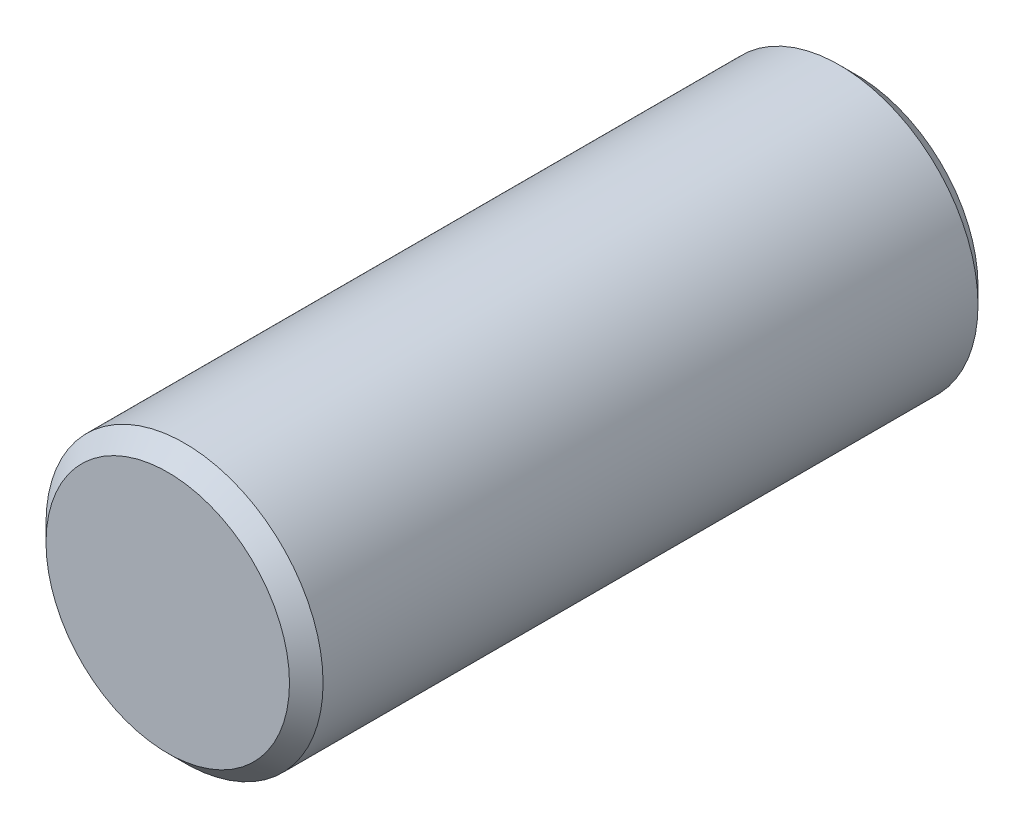
ISO-10303-21;
HEADER;
FILE_DESCRIPTION(('STEP AP214'),'2;1');
FILE_NAME('part.step','',(''),(''),'','','');
FILE_SCHEMA(('AUTOMOTIVE_DESIGN { 1 0 10303 214 1 1 1 1 }'));
ENDSEC;
DATA;
#1=APPLICATION_CONTEXT('core data for automotive mechanical design processes');
#2=APPLICATION_PROTOCOL_DEFINITION('international standard','automotive_design',2000,#1);
#3=PRODUCT_CONTEXT('',#1,'mechanical');
#4=PRODUCT('Part','Part','',(#3));
#5=PRODUCT_RELATED_PRODUCT_CATEGORY('part','',(#4));
#6=PRODUCT_DEFINITION_FORMATION('','',#4);
#7=PRODUCT_DEFINITION_CONTEXT('part definition',#1,'design');
#8=PRODUCT_DEFINITION('design','',#6,#7);
#9=PRODUCT_DEFINITION_SHAPE('','',#8);
#10=(LENGTH_UNIT() NAMED_UNIT(*) SI_UNIT(.MILLI.,.METRE.));
#11=(NAMED_UNIT(*) PLANE_ANGLE_UNIT() SI_UNIT($,.RADIAN.));
#12=(NAMED_UNIT(*) SI_UNIT($,.STERADIAN.) SOLID_ANGLE_UNIT());
#13=UNCERTAINTY_MEASURE_WITH_UNIT(LENGTH_MEASURE(1.E-05),#10,'distance_accuracy_value','');
#14=(GEOMETRIC_REPRESENTATION_CONTEXT(3) GLOBAL_UNCERTAINTY_ASSIGNED_CONTEXT((#13)) GLOBAL_UNIT_ASSIGNED_CONTEXT((#10,
#11,#12)) REPRESENTATION_CONTEXT('',''));
#15=CARTESIAN_POINT('',(0.,0.,0.));
#16=DIRECTION('',(0.,0.,1.));
#17=DIRECTION('',(1.,0.,0.));
#18=AXIS2_PLACEMENT_3D('',#15,#16,#17);
#19=CARTESIAN_POINT('',(0.,0.,41.));
#20=DIRECTION('',(0.,0.,-1.));
#21=DIRECTION('',(-1.,0.,0.));
#22=AXIS2_PLACEMENT_3D('',#19,#20,#21);
#23=CYLINDRICAL_SURFACE('',#22,16.5);
#24=CARTESIAN_POINT('',(0.,0.,-39.));
#25=DIRECTION('',(0.,0.,1.));
#26=DIRECTION('',(1.,0.,0.));
#27=AXIS2_PLACEMENT_3D('',#24,#25,#26);
#28=CIRCLE('',#27,16.5);
#29=CARTESIAN_POINT('',(16.5,0.,-39.));
#30=VERTEX_POINT('',#29);
#31=EDGE_CURVE('E54',#30,#30,#28,.T.);
#32=ORIENTED_EDGE('',*,*,#31,.T.);
#33=EDGE_LOOP('',(#32));
#34=FACE_BOUND('',#33,.T.);
#35=CARTESIAN_POINT('',(0.,0.,39.));
#36=DIRECTION('',(0.,0.,1.));
#37=DIRECTION('',(1.,0.,0.));
#38=AXIS2_PLACEMENT_3D('',#35,#36,#37);
#39=CIRCLE('',#38,16.5);
#40=CARTESIAN_POINT('',(16.5,0.,39.));
#41=VERTEX_POINT('',#40);
#42=EDGE_CURVE('E56',#41,#41,#39,.F.);
#43=ORIENTED_EDGE('',*,*,#42,.T.);
#44=EDGE_LOOP('',(#43));
#45=FACE_BOUND('',#44,.T.);
#46=ADVANCED_FACE('F43',(#34,#45),#23,.T.);
#47=CARTESIAN_POINT('',(0.,0.,41.));
#48=DIRECTION('',(0.,0.,1.));
#49=DIRECTION('',(1.,0.,0.));
#50=AXIS2_PLACEMENT_3D('',#47,#48,#49);
#51=PLANE('',#50);
#52=CARTESIAN_POINT('',(0.,0.,41.));
#53=DIRECTION('',(0.,0.,1.));
#54=DIRECTION('',(1.,0.,0.));
#55=AXIS2_PLACEMENT_3D('',#52,#53,#54);
#56=CIRCLE('',#55,14.5);
#57=CARTESIAN_POINT('',(14.5,0.,41.));
#58=VERTEX_POINT('',#57);
#59=EDGE_CURVE('E10',#58,#58,#56,.T.);
#60=ORIENTED_EDGE('',*,*,#59,.T.);
#61=EDGE_LOOP('',(#60));
#62=FACE_BOUND('',#61,.T.);
#63=ADVANCED_FACE('F73',(#62),#51,.T.);
#64=CARTESIAN_POINT('',(0.,0.,-41.));
#65=DIRECTION('',(0.,0.,1.));
#66=DIRECTION('',(1.,0.,0.));
#67=AXIS2_PLACEMENT_3D('',#64,#65,#66);
#68=PLANE('',#67);
#69=CARTESIAN_POINT('',(0.,0.,-41.));
#70=DIRECTION('',(0.,0.,1.));
#71=DIRECTION('',(1.,0.,0.));
#72=AXIS2_PLACEMENT_3D('',#69,#70,#71);
#73=CIRCLE('',#72,14.5);
#74=CARTESIAN_POINT('',(14.5,0.,-41.));
#75=VERTEX_POINT('',#74);
#76=EDGE_CURVE('E51',#75,#75,#73,.F.);
#77=ORIENTED_EDGE('',*,*,#76,.T.);
#78=EDGE_LOOP('',(#77));
#79=FACE_BOUND('',#78,.T.);
#80=ADVANCED_FACE('F75',(#79),#68,.F.);
#81=CARTESIAN_POINT('',(0.,0.,-39.));
#82=DIRECTION('',(0.,0.,1.));
#83=DIRECTION('',(1.,0.,0.));
#84=AXIS2_PLACEMENT_3D('',#81,#82,#83);
#85=CONICAL_SURFACE('',#84,16.5,0.785398163397449);
#86=ORIENTED_EDGE('',*,*,#76,.F.);
#87=EDGE_LOOP('',(#86));
#88=FACE_BOUND('',#87,.T.);
#89=ORIENTED_EDGE('',*,*,#31,.F.);
#90=EDGE_LOOP('',(#89));
#91=FACE_BOUND('',#90,.T.);
#92=ADVANCED_FACE('F66',(#88,#91),#85,.T.);
#93=CARTESIAN_POINT('',(0.,0.,41.));
#94=DIRECTION('',(0.,0.,-1.));
#95=DIRECTION('',(-1.,0.,0.));
#96=AXIS2_PLACEMENT_3D('',#93,#94,#95);
#97=CONICAL_SURFACE('',#96,14.5,0.785398163397444);
#98=ORIENTED_EDGE('',*,*,#42,.F.);
#99=EDGE_LOOP('',(#98));
#100=FACE_BOUND('',#99,.T.);
#101=ORIENTED_EDGE('',*,*,#59,.F.);
#102=EDGE_LOOP('',(#101));
#103=FACE_BOUND('',#102,.T.);
#104=ADVANCED_FACE('F46',(#100,#103),#97,.T.);
#105=CLOSED_SHELL('',(#46,#63,#80,#92,#104));
#106=MANIFOLD_SOLID_BREP('B2',#105);
#107=ADVANCED_BREP_SHAPE_REPRESENTATION('',(#18,#106),#14);
#108=SHAPE_DEFINITION_REPRESENTATION(#9,#107);
ENDSEC;
END-ISO-10303-21;
